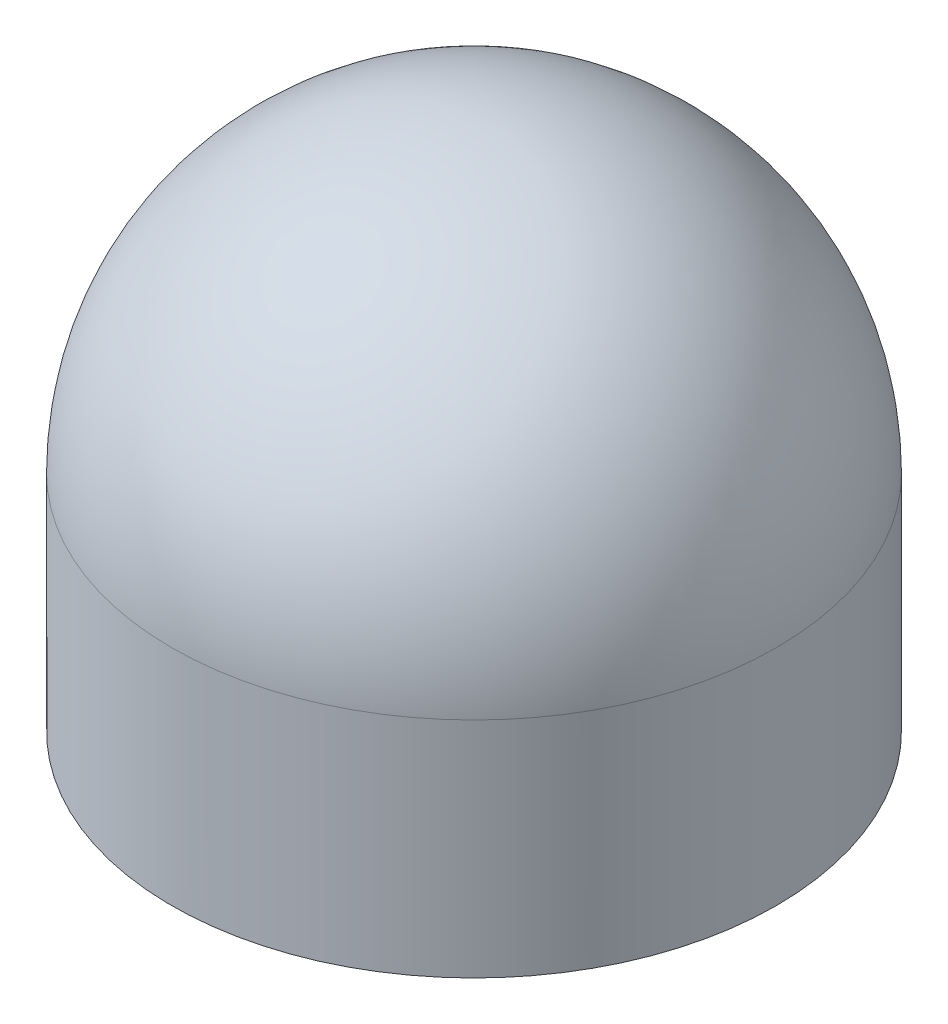
ISO-10303-21;
HEADER;
FILE_DESCRIPTION(('STEP AP214'),'2;1');
FILE_NAME('part.step','',(''),(''),'','','');
FILE_SCHEMA(('AUTOMOTIVE_DESIGN { 1 0 10303 214 1 1 1 1 }'));
ENDSEC;
DATA;
#1=APPLICATION_CONTEXT('core data for automotive mechanical design processes');
#2=APPLICATION_PROTOCOL_DEFINITION('international standard','automotive_design',2000,#1);
#3=PRODUCT_CONTEXT('',#1,'mechanical');
#4=PRODUCT('Part','Part','',(#3));
#5=PRODUCT_RELATED_PRODUCT_CATEGORY('part','',(#4));
#6=PRODUCT_DEFINITION_FORMATION('','',#4);
#7=PRODUCT_DEFINITION_CONTEXT('part definition',#1,'design');
#8=PRODUCT_DEFINITION('design','',#6,#7);
#9=PRODUCT_DEFINITION_SHAPE('','',#8);
#10=(LENGTH_UNIT() NAMED_UNIT(*) SI_UNIT(.MILLI.,.METRE.));
#11=(NAMED_UNIT(*) PLANE_ANGLE_UNIT() SI_UNIT($,.RADIAN.));
#12=(NAMED_UNIT(*) SI_UNIT($,.STERADIAN.) SOLID_ANGLE_UNIT());
#13=UNCERTAINTY_MEASURE_WITH_UNIT(LENGTH_MEASURE(1.E-05),#10,'distance_accuracy_value','');
#14=(GEOMETRIC_REPRESENTATION_CONTEXT(3) GLOBAL_UNCERTAINTY_ASSIGNED_CONTEXT((#13)) GLOBAL_UNIT_ASSIGNED_CONTEXT((#10,
#11,#12)) REPRESENTATION_CONTEXT('',''));
#15=CARTESIAN_POINT('',(0.,0.,0.));
#16=DIRECTION('',(0.,0.,1.));
#17=DIRECTION('',(1.,0.,0.));
#18=AXIS2_PLACEMENT_3D('',#15,#16,#17);
#19=CARTESIAN_POINT('',(0.,8.5,0.));
#20=DIRECTION('',(0.,-1.,0.));
#21=DIRECTION('',(-1.,0.,0.));
#22=AXIS2_PLACEMENT_3D('',#19,#20,#21);
#23=SPHERICAL_SURFACE('',#22,11.5);
#24=CARTESIAN_POINT('',(0.,8.5,0.));
#25=DIRECTION('',(0.,-1.,0.));
#26=DIRECTION('',(1.,0.,0.));
#27=AXIS2_PLACEMENT_3D('',#24,#25,#26);
#28=CIRCLE('',#27,11.5);
#29=CARTESIAN_POINT('',(11.5,8.49999999999999,0.));
#30=VERTEX_POINT('',#29);
#31=EDGE_CURVE('E47',#30,#30,#28,.T.);
#32=ORIENTED_EDGE('',*,*,#31,.F.);
#33=EDGE_LOOP('',(#32));
#34=FACE_BOUND('',#33,.T.);
#35=ADVANCED_FACE('F33',(#34),#23,.T.);
#36=CARTESIAN_POINT('',(0.,8.5,0.));
#37=DIRECTION('',(0.,-1.,0.));
#38=DIRECTION('',(-1.,0.,0.));
#39=AXIS2_PLACEMENT_3D('',#36,#37,#38);
#40=SPHERICAL_SURFACE('',#39,10.);
#41=CARTESIAN_POINT('',(0.,8.5,0.));
#42=DIRECTION('',(0.,-1.,0.));
#43=DIRECTION('',(1.,0.,0.));
#44=AXIS2_PLACEMENT_3D('',#41,#42,#43);
#45=CIRCLE('',#44,9.99999999999999);
#46=CARTESIAN_POINT('',(10.,8.49999999999999,0.));
#47=VERTEX_POINT('',#46);
#48=EDGE_CURVE('E10',#47,#47,#45,.T.);
#49=ORIENTED_EDGE('',*,*,#48,.T.);
#50=EDGE_LOOP('',(#49));
#51=FACE_BOUND('',#50,.T.);
#52=ADVANCED_FACE('F56',(#51),#40,.F.);
#53=CARTESIAN_POINT('',(0.,0.,0.));
#54=DIRECTION('',(0.,-1.,0.));
#55=DIRECTION('',(1.,0.,0.));
#56=AXIS2_PLACEMENT_3D('',#53,#54,#55);
#57=CYLINDRICAL_SURFACE('',#56,9.99999999999999);
#58=ORIENTED_EDGE('',*,*,#48,.F.);
#59=EDGE_LOOP('',(#58));
#60=FACE_BOUND('',#59,.T.);
#61=CARTESIAN_POINT('',(0.,0.,0.));
#62=DIRECTION('',(0.,-1.,0.));
#63=DIRECTION('',(1.,0.,0.));
#64=AXIS2_PLACEMENT_3D('',#61,#62,#63);
#65=CIRCLE('',#64,9.99999999999999);
#66=CARTESIAN_POINT('',(9.99999999999999,0.,0.));
#67=VERTEX_POINT('',#66);
#68=EDGE_CURVE('E39',#67,#67,#65,.T.);
#69=ORIENTED_EDGE('',*,*,#68,.T.);
#70=EDGE_LOOP('',(#69));
#71=FACE_BOUND('',#70,.T.);
#72=ADVANCED_FACE('F60',(#60,#71),#57,.F.);
#73=CARTESIAN_POINT('',(-9.99999999999999,0.,0.));
#74=DIRECTION('',(0.,1.,0.));
#75=DIRECTION('',(-1.,0.,0.));
#76=AXIS2_PLACEMENT_3D('',#73,#74,#75);
#77=PLANE('',#76);
#78=ORIENTED_EDGE('',*,*,#68,.F.);
#79=EDGE_LOOP('',(#78));
#80=FACE_BOUND('',#79,.T.);
#81=CARTESIAN_POINT('',(0.,0.,0.));
#82=DIRECTION('',(0.,-1.,0.));
#83=DIRECTION('',(1.,0.,0.));
#84=AXIS2_PLACEMENT_3D('',#81,#82,#83);
#85=CIRCLE('',#84,11.5);
#86=CARTESIAN_POINT('',(11.5,0.,0.));
#87=VERTEX_POINT('',#86);
#88=EDGE_CURVE('E43',#87,#87,#85,.T.);
#89=ORIENTED_EDGE('',*,*,#88,.T.);
#90=EDGE_LOOP('',(#89));
#91=FACE_BOUND('',#90,.T.);
#92=ADVANCED_FACE('F64',(#80,#91),#77,.F.);
#93=CARTESIAN_POINT('',(0.,0.,0.));
#94=DIRECTION('',(0.,-1.,0.));
#95=DIRECTION('',(1.,0.,0.));
#96=AXIS2_PLACEMENT_3D('',#93,#94,#95);
#97=CYLINDRICAL_SURFACE('',#96,11.5);
#98=ORIENTED_EDGE('',*,*,#88,.F.);
#99=EDGE_LOOP('',(#98));
#100=FACE_BOUND('',#99,.T.);
#101=ORIENTED_EDGE('',*,*,#31,.T.);
#102=EDGE_LOOP('',(#101));
#103=FACE_BOUND('',#102,.T.);
#104=ADVANCED_FACE('F53',(#100,#103),#97,.T.);
#105=CLOSED_SHELL('',(#35,#52,#72,#92,#104));
#106=MANIFOLD_SOLID_BREP('B2',#105);
#107=ADVANCED_BREP_SHAPE_REPRESENTATION('',(#18,#106),#14);
#108=SHAPE_DEFINITION_REPRESENTATION(#9,#107);
ENDSEC;
END-ISO-10303-21;
